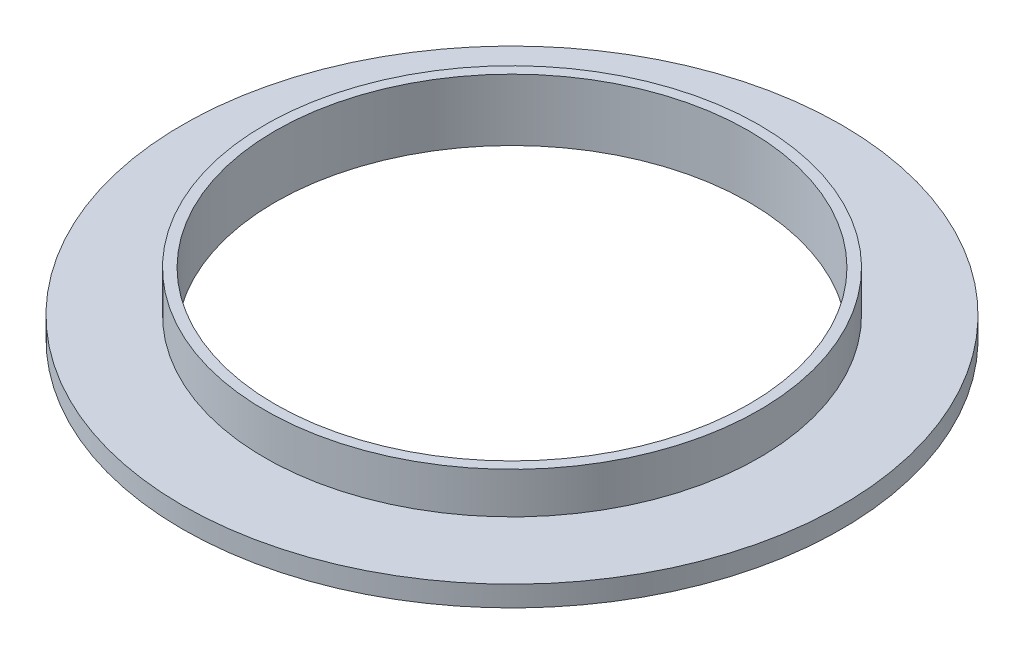
ISO-10303-21;
HEADER;
FILE_DESCRIPTION(('STEP AP214'),'2;1');
FILE_NAME('part.step','',(''),(''),'','','');
FILE_SCHEMA(('AUTOMOTIVE_DESIGN { 1 0 10303 214 1 1 1 1 }'));
ENDSEC;
DATA;
#1=APPLICATION_CONTEXT('core data for automotive mechanical design processes');
#2=APPLICATION_PROTOCOL_DEFINITION('international standard','automotive_design',2000,#1);
#3=PRODUCT_CONTEXT('',#1,'mechanical');
#4=PRODUCT('Part','Part','',(#3));
#5=PRODUCT_RELATED_PRODUCT_CATEGORY('part','',(#4));
#6=PRODUCT_DEFINITION_FORMATION('','',#4);
#7=PRODUCT_DEFINITION_CONTEXT('part definition',#1,'design');
#8=PRODUCT_DEFINITION('design','',#6,#7);
#9=PRODUCT_DEFINITION_SHAPE('','',#8);
#10=(LENGTH_UNIT() NAMED_UNIT(*) SI_UNIT(.MILLI.,.METRE.));
#11=(NAMED_UNIT(*) PLANE_ANGLE_UNIT() SI_UNIT($,.RADIAN.));
#12=(NAMED_UNIT(*) SI_UNIT($,.STERADIAN.) SOLID_ANGLE_UNIT());
#13=UNCERTAINTY_MEASURE_WITH_UNIT(LENGTH_MEASURE(1.E-05),#10,'distance_accuracy_value','');
#14=(GEOMETRIC_REPRESENTATION_CONTEXT(3) GLOBAL_UNCERTAINTY_ASSIGNED_CONTEXT((#13)) GLOBAL_UNIT_ASSIGNED_CONTEXT((#10,
#11,#12)) REPRESENTATION_CONTEXT('',''));
#15=CARTESIAN_POINT('',(0.,0.,0.));
#16=DIRECTION('',(0.,0.,1.));
#17=DIRECTION('',(1.,0.,0.));
#18=AXIS2_PLACEMENT_3D('',#15,#16,#17);
#19=CARTESIAN_POINT('',(0.,0.,0.));
#20=DIRECTION('',(0.,-1.,0.));
#21=DIRECTION('',(0.,0.,-1.));
#22=AXIS2_PLACEMENT_3D('',#19,#20,#21);
#23=CYLINDRICAL_SURFACE('',#22,11.5);
#24=CARTESIAN_POINT('',(0.,3.,0.));
#25=DIRECTION('',(0.,-1.,0.));
#26=DIRECTION('',(0.,0.,-1.));
#27=AXIS2_PLACEMENT_3D('',#24,#25,#26);
#28=CIRCLE('',#27,11.5);
#29=CARTESIAN_POINT('',(0.,3.,-11.5));
#30=VERTEX_POINT('',#29);
#31=EDGE_CURVE('E61',#30,#30,#28,.T.);
#32=ORIENTED_EDGE('',*,*,#31,.F.);
#33=EDGE_LOOP('',(#32));
#34=FACE_BOUND('',#33,.T.);
#35=CARTESIAN_POINT('',(0.,0.,0.));
#36=DIRECTION('',(0.,-1.,0.));
#37=DIRECTION('',(0.,0.,-1.));
#38=AXIS2_PLACEMENT_3D('',#35,#36,#37);
#39=CIRCLE('',#38,11.5);
#40=CARTESIAN_POINT('',(0.,0.,-11.5));
#41=VERTEX_POINT('',#40);
#42=EDGE_CURVE('E10',#41,#41,#39,.T.);
#43=ORIENTED_EDGE('',*,*,#42,.T.);
#44=EDGE_LOOP('',(#43));
#45=FACE_BOUND('',#44,.T.);
#46=ADVANCED_FACE('F39',(#34,#45),#23,.F.);
#47=CARTESIAN_POINT('',(-11.5,0.,0.));
#48=DIRECTION('',(0.,1.,0.));
#49=DIRECTION('',(0.,0.,1.));
#50=AXIS2_PLACEMENT_3D('',#47,#48,#49);
#51=PLANE('',#50);
#52=ORIENTED_EDGE('',*,*,#42,.F.);
#53=EDGE_LOOP('',(#52));
#54=FACE_BOUND('',#53,.T.);
#55=CARTESIAN_POINT('',(0.,0.,0.));
#56=DIRECTION('',(0.,-1.,0.));
#57=DIRECTION('',(0.,0.,-1.));
#58=AXIS2_PLACEMENT_3D('',#55,#56,#57);
#59=CIRCLE('',#58,16.);
#60=CARTESIAN_POINT('',(0.,0.,-16.));
#61=VERTEX_POINT('',#60);
#62=EDGE_CURVE('E45',#61,#61,#59,.T.);
#63=ORIENTED_EDGE('',*,*,#62,.T.);
#64=EDGE_LOOP('',(#63));
#65=FACE_BOUND('',#64,.T.);
#66=ADVANCED_FACE('F68',(#54,#65),#51,.F.);
#67=CARTESIAN_POINT('',(0.,0.,0.));
#68=DIRECTION('',(0.,-1.,0.));
#69=DIRECTION('',(0.,0.,-1.));
#70=AXIS2_PLACEMENT_3D('',#67,#68,#69);
#71=CYLINDRICAL_SURFACE('',#70,16.);
#72=ORIENTED_EDGE('',*,*,#62,.F.);
#73=EDGE_LOOP('',(#72));
#74=FACE_BOUND('',#73,.T.);
#75=CARTESIAN_POINT('',(0.,0.999999999999999,0.));
#76=DIRECTION('',(0.,-1.,0.));
#77=DIRECTION('',(0.,0.,-1.));
#78=AXIS2_PLACEMENT_3D('',#75,#76,#77);
#79=CIRCLE('',#78,16.);
#80=CARTESIAN_POINT('',(0.,0.999999999999999,-16.));
#81=VERTEX_POINT('',#80);
#82=EDGE_CURVE('E49',#81,#81,#79,.T.);
#83=ORIENTED_EDGE('',*,*,#82,.T.);
#84=EDGE_LOOP('',(#83));
#85=FACE_BOUND('',#84,.T.);
#86=ADVANCED_FACE('F72',(#74,#85),#71,.T.);
#87=CARTESIAN_POINT('',(-16.,0.999999999999999,0.));
#88=DIRECTION('',(0.,-1.,0.));
#89=DIRECTION('',(0.,0.,-1.));
#90=AXIS2_PLACEMENT_3D('',#87,#88,#89);
#91=PLANE('',#90);
#92=ORIENTED_EDGE('',*,*,#82,.F.);
#93=EDGE_LOOP('',(#92));
#94=FACE_BOUND('',#93,.T.);
#95=CARTESIAN_POINT('',(0.,0.999999999999999,0.));
#96=DIRECTION('',(0.,-1.,0.));
#97=DIRECTION('',(0.,0.,-1.));
#98=AXIS2_PLACEMENT_3D('',#95,#96,#97);
#99=CIRCLE('',#98,12.);
#100=CARTESIAN_POINT('',(0.,0.999999999999999,-12.));
#101=VERTEX_POINT('',#100);
#102=EDGE_CURVE('E53',#101,#101,#99,.T.);
#103=ORIENTED_EDGE('',*,*,#102,.T.);
#104=EDGE_LOOP('',(#103));
#105=FACE_BOUND('',#104,.T.);
#106=ADVANCED_FACE('F77',(#94,#105),#91,.F.);
#107=CARTESIAN_POINT('',(0.,0.,0.));
#108=DIRECTION('',(0.,-1.,0.));
#109=DIRECTION('',(0.,0.,-1.));
#110=AXIS2_PLACEMENT_3D('',#107,#108,#109);
#111=CYLINDRICAL_SURFACE('',#110,12.);
#112=ORIENTED_EDGE('',*,*,#102,.F.);
#113=EDGE_LOOP('',(#112));
#114=FACE_BOUND('',#113,.T.);
#115=CARTESIAN_POINT('',(0.,3.,0.));
#116=DIRECTION('',(0.,-1.,0.));
#117=DIRECTION('',(0.,0.,-1.));
#118=AXIS2_PLACEMENT_3D('',#115,#116,#117);
#119=CIRCLE('',#118,12.);
#120=CARTESIAN_POINT('',(0.,3.,-12.));
#121=VERTEX_POINT('',#120);
#122=EDGE_CURVE('E58',#121,#121,#119,.T.);
#123=ORIENTED_EDGE('',*,*,#122,.T.);
#124=EDGE_LOOP('',(#123));
#125=FACE_BOUND('',#124,.T.);
#126=ADVANCED_FACE('F83',(#114,#125),#111,.T.);
#127=CARTESIAN_POINT('',(-12.,3.,0.));
#128=DIRECTION('',(0.,-1.,0.));
#129=DIRECTION('',(0.,0.,-1.));
#130=AXIS2_PLACEMENT_3D('',#127,#128,#129);
#131=PLANE('',#130);
#132=ORIENTED_EDGE('',*,*,#122,.F.);
#133=EDGE_LOOP('',(#132));
#134=FACE_BOUND('',#133,.T.);
#135=ORIENTED_EDGE('',*,*,#31,.T.);
#136=EDGE_LOOP('',(#135));
#137=FACE_BOUND('',#136,.T.);
#138=ADVANCED_FACE('F65',(#134,#137),#131,.F.);
#139=CLOSED_SHELL('',(#46,#66,#86,#106,#126,#138));
#140=MANIFOLD_SOLID_BREP('B2',#139);
#141=ADVANCED_BREP_SHAPE_REPRESENTATION('',(#18,#140),#14);
#142=SHAPE_DEFINITION_REPRESENTATION(#9,#141);
ENDSEC;
END-ISO-10303-21;
